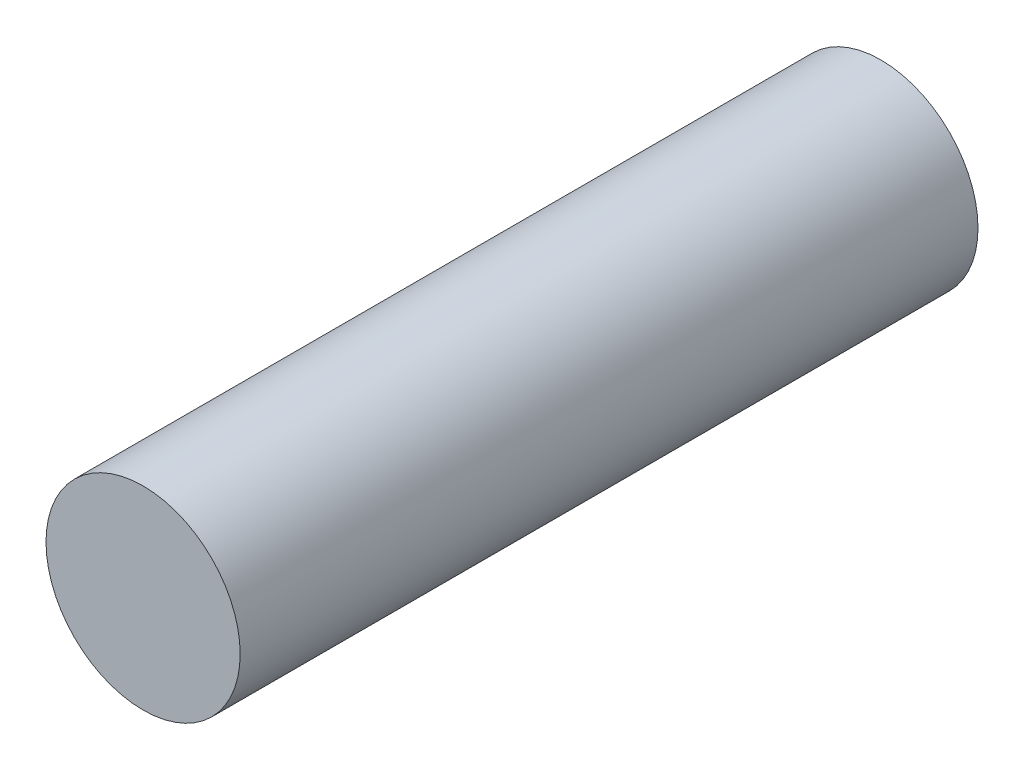
ISO-10303-21;
HEADER;
FILE_DESCRIPTION(('STEP AP214'),'2;1');
FILE_NAME('part.step','',(''),(''),'','','');
FILE_SCHEMA(('AUTOMOTIVE_DESIGN { 1 0 10303 214 1 1 1 1 }'));
ENDSEC;
DATA;
#1=APPLICATION_CONTEXT('core data for automotive mechanical design processes');
#2=APPLICATION_PROTOCOL_DEFINITION('international standard','automotive_design',2000,#1);
#3=PRODUCT_CONTEXT('',#1,'mechanical');
#4=PRODUCT('Part','Part','',(#3));
#5=PRODUCT_RELATED_PRODUCT_CATEGORY('part','',(#4));
#6=PRODUCT_DEFINITION_FORMATION('','',#4);
#7=PRODUCT_DEFINITION_CONTEXT('part definition',#1,'design');
#8=PRODUCT_DEFINITION('design','',#6,#7);
#9=PRODUCT_DEFINITION_SHAPE('','',#8);
#10=(LENGTH_UNIT() NAMED_UNIT(*) SI_UNIT(.MILLI.,.METRE.));
#11=(NAMED_UNIT(*) PLANE_ANGLE_UNIT() SI_UNIT($,.RADIAN.));
#12=(NAMED_UNIT(*) SI_UNIT($,.STERADIAN.) SOLID_ANGLE_UNIT());
#13=UNCERTAINTY_MEASURE_WITH_UNIT(LENGTH_MEASURE(1.E-05),#10,'distance_accuracy_value','');
#14=(GEOMETRIC_REPRESENTATION_CONTEXT(3) GLOBAL_UNCERTAINTY_ASSIGNED_CONTEXT((#13)) GLOBAL_UNIT_ASSIGNED_CONTEXT((#10,
#11,#12)) REPRESENTATION_CONTEXT('',''));
#15=CARTESIAN_POINT('',(0.,0.,0.));
#16=DIRECTION('',(0.,0.,1.));
#17=DIRECTION('',(1.,0.,0.));
#18=AXIS2_PLACEMENT_3D('',#15,#16,#17);
#19=CARTESIAN_POINT('',(0.,0.,8.17));
#20=DIRECTION('',(0.,0.,-1.));
#21=DIRECTION('',(-1.,0.,0.));
#22=AXIS2_PLACEMENT_3D('',#19,#20,#21);
#23=CYLINDRICAL_SURFACE('',#22,1.075);
#24=CARTESIAN_POINT('',(0.,0.,8.17));
#25=DIRECTION('',(0.,0.,1.));
#26=DIRECTION('',(1.,0.,0.));
#27=AXIS2_PLACEMENT_3D('',#24,#25,#26);
#28=CIRCLE('',#27,1.075);
#29=CARTESIAN_POINT('',(1.075,0.,8.17));
#30=VERTEX_POINT('',#29);
#31=EDGE_CURVE('E10',#30,#30,#28,.T.);
#32=ORIENTED_EDGE('',*,*,#31,.F.);
#33=EDGE_LOOP('',(#32));
#34=FACE_BOUND('',#33,.T.);
#35=CARTESIAN_POINT('',(0.,0.,0.));
#36=DIRECTION('',(0.,0.,1.));
#37=DIRECTION('',(1.,0.,0.));
#38=AXIS2_PLACEMENT_3D('',#35,#36,#37);
#39=CIRCLE('',#38,1.075);
#40=CARTESIAN_POINT('',(1.075,0.,0.));
#41=VERTEX_POINT('',#40);
#42=EDGE_CURVE('E35',#41,#41,#39,.T.);
#43=ORIENTED_EDGE('',*,*,#42,.T.);
#44=EDGE_LOOP('',(#43));
#45=FACE_BOUND('',#44,.T.);
#46=ADVANCED_FACE('F32',(#34,#45),#23,.T.);
#47=CARTESIAN_POINT('',(0.,0.,8.17));
#48=DIRECTION('',(0.,0.,1.));
#49=DIRECTION('',(1.,0.,0.));
#50=AXIS2_PLACEMENT_3D('',#47,#48,#49);
#51=PLANE('',#50);
#52=ORIENTED_EDGE('',*,*,#31,.T.);
#53=EDGE_LOOP('',(#52));
#54=FACE_BOUND('',#53,.T.);
#55=ADVANCED_FACE('F47',(#54),#51,.T.);
#56=CARTESIAN_POINT('',(0.,0.,0.));
#57=DIRECTION('',(0.,0.,1.));
#58=DIRECTION('',(1.,0.,0.));
#59=AXIS2_PLACEMENT_3D('',#56,#57,#58);
#60=PLANE('',#59);
#61=ORIENTED_EDGE('',*,*,#42,.F.);
#62=EDGE_LOOP('',(#61));
#63=FACE_BOUND('',#62,.T.);
#64=ADVANCED_FACE('F45',(#63),#60,.F.);
#65=CLOSED_SHELL('',(#46,#55,#64));
#66=MANIFOLD_SOLID_BREP('B2',#65);
#67=ADVANCED_BREP_SHAPE_REPRESENTATION('',(#18,#66),#14);
#68=SHAPE_DEFINITION_REPRESENTATION(#9,#67);
ENDSEC;
END-ISO-10303-21;
